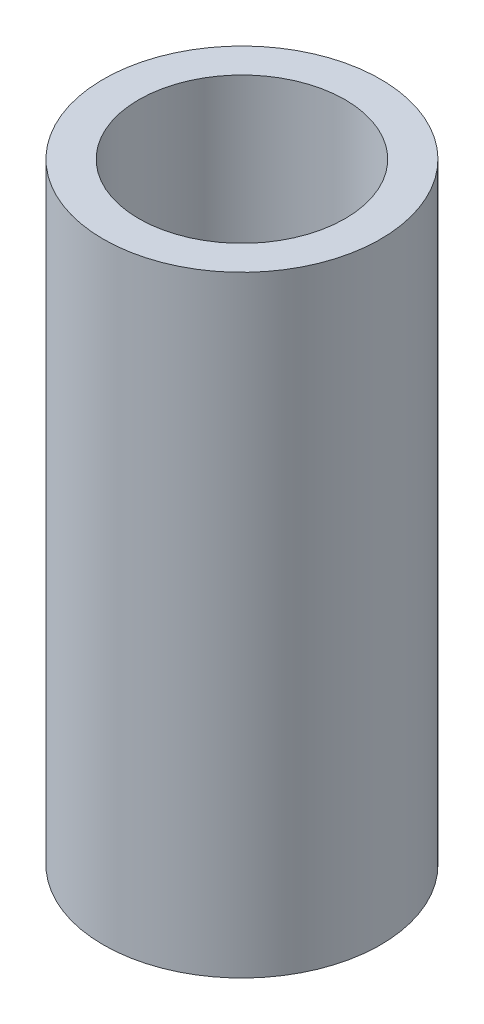
ISO-10303-21;
HEADER;
FILE_DESCRIPTION(('STEP AP214'),'2;1');
FILE_NAME('part.step','',(''),(''),'','','');
FILE_SCHEMA(('AUTOMOTIVE_DESIGN { 1 0 10303 214 1 1 1 1 }'));
ENDSEC;
DATA;
#1=APPLICATION_CONTEXT('core data for automotive mechanical design processes');
#2=APPLICATION_PROTOCOL_DEFINITION('international standard','automotive_design',2000,#1);
#3=PRODUCT_CONTEXT('',#1,'mechanical');
#4=PRODUCT('Part','Part','',(#3));
#5=PRODUCT_RELATED_PRODUCT_CATEGORY('part','',(#4));
#6=PRODUCT_DEFINITION_FORMATION('','',#4);
#7=PRODUCT_DEFINITION_CONTEXT('part definition',#1,'design');
#8=PRODUCT_DEFINITION('design','',#6,#7);
#9=PRODUCT_DEFINITION_SHAPE('','',#8);
#10=(LENGTH_UNIT() NAMED_UNIT(*) SI_UNIT(.MILLI.,.METRE.));
#11=(NAMED_UNIT(*) PLANE_ANGLE_UNIT() SI_UNIT($,.RADIAN.));
#12=(NAMED_UNIT(*) SI_UNIT($,.STERADIAN.) SOLID_ANGLE_UNIT());
#13=UNCERTAINTY_MEASURE_WITH_UNIT(LENGTH_MEASURE(1.E-05),#10,'distance_accuracy_value','');
#14=(GEOMETRIC_REPRESENTATION_CONTEXT(3) GLOBAL_UNCERTAINTY_ASSIGNED_CONTEXT((#13)) GLOBAL_UNIT_ASSIGNED_CONTEXT((#10,
#11,#12)) REPRESENTATION_CONTEXT('',''));
#15=CARTESIAN_POINT('',(0.,0.,0.));
#16=DIRECTION('',(0.,0.,1.));
#17=DIRECTION('',(1.,0.,0.));
#18=AXIS2_PLACEMENT_3D('',#15,#16,#17);
#19=CARTESIAN_POINT('',(0.,3.5,0.));
#20=DIRECTION('',(0.,-1.,0.));
#21=DIRECTION('',(0.,0.,-1.));
#22=AXIS2_PLACEMENT_3D('',#19,#20,#21);
#23=CYLINDRICAL_SURFACE('',#22,1.5875);
#24=CARTESIAN_POINT('',(0.,3.5,0.));
#25=DIRECTION('',(0.,1.,0.));
#26=DIRECTION('',(0.,0.,1.));
#27=AXIS2_PLACEMENT_3D('',#24,#25,#26);
#28=CIRCLE('',#27,1.5875);
#29=CARTESIAN_POINT('',(0.,3.5,1.5875));
#30=VERTEX_POINT('',#29);
#31=EDGE_CURVE('E10',#30,#30,#28,.T.);
#32=ORIENTED_EDGE('',*,*,#31,.F.);
#33=EDGE_LOOP('',(#32));
#34=FACE_BOUND('',#33,.T.);
#35=CARTESIAN_POINT('',(0.,-3.5,0.));
#36=DIRECTION('',(0.,1.,0.));
#37=DIRECTION('',(0.,0.,1.));
#38=AXIS2_PLACEMENT_3D('',#35,#36,#37);
#39=CIRCLE('',#38,1.5875);
#40=CARTESIAN_POINT('',(0.,-3.5,1.5875));
#41=VERTEX_POINT('',#40);
#42=EDGE_CURVE('E34',#41,#41,#39,.T.);
#43=ORIENTED_EDGE('',*,*,#42,.T.);
#44=EDGE_LOOP('',(#43));
#45=FACE_BOUND('',#44,.T.);
#46=ADVANCED_FACE('F31',(#34,#45),#23,.T.);
#47=CARTESIAN_POINT('',(0.,3.5,0.));
#48=DIRECTION('',(0.,1.,0.));
#49=DIRECTION('',(0.,0.,1.));
#50=AXIS2_PLACEMENT_3D('',#47,#48,#49);
#51=PLANE('',#50);
#52=CARTESIAN_POINT('',(0.,3.5,0.));
#53=DIRECTION('',(0.,1.,0.));
#54=DIRECTION('',(0.,0.,1.));
#55=AXIS2_PLACEMENT_3D('',#52,#53,#54);
#56=CIRCLE('',#55,1.1811);
#57=CARTESIAN_POINT('',(0.,3.5,1.1811));
#58=VERTEX_POINT('',#57);
#59=EDGE_CURVE('E43',#58,#58,#56,.T.);
#60=ORIENTED_EDGE('',*,*,#59,.F.);
#61=EDGE_LOOP('',(#60));
#62=FACE_BOUND('',#61,.T.);
#63=ORIENTED_EDGE('',*,*,#31,.T.);
#64=EDGE_LOOP('',(#63));
#65=FACE_BOUND('',#64,.T.);
#66=ADVANCED_FACE('F58',(#62,#65),#51,.T.);
#67=CARTESIAN_POINT('',(0.,-3.5,0.));
#68=DIRECTION('',(0.,1.,0.));
#69=DIRECTION('',(0.,0.,1.));
#70=AXIS2_PLACEMENT_3D('',#67,#68,#69);
#71=PLANE('',#70);
#72=CARTESIAN_POINT('',(0.,-3.5,0.));
#73=DIRECTION('',(0.,1.,0.));
#74=DIRECTION('',(0.,0.,1.));
#75=AXIS2_PLACEMENT_3D('',#72,#73,#74);
#76=CIRCLE('',#75,1.1811);
#77=CARTESIAN_POINT('',(0.,-3.5,1.1811));
#78=VERTEX_POINT('',#77);
#79=EDGE_CURVE('E41',#78,#78,#76,.T.);
#80=ORIENTED_EDGE('',*,*,#79,.T.);
#81=EDGE_LOOP('',(#80));
#82=FACE_BOUND('',#81,.T.);
#83=ORIENTED_EDGE('',*,*,#42,.F.);
#84=EDGE_LOOP('',(#83));
#85=FACE_BOUND('',#84,.T.);
#86=ADVANCED_FACE('F49',(#82,#85),#71,.F.);
#87=CARTESIAN_POINT('',(0.,-3.5,0.));
#88=DIRECTION('',(0.,1.,0.));
#89=DIRECTION('',(0.,0.,1.));
#90=AXIS2_PLACEMENT_3D('',#87,#88,#89);
#91=CYLINDRICAL_SURFACE('',#90,1.1811);
#92=ORIENTED_EDGE('',*,*,#79,.F.);
#93=EDGE_LOOP('',(#92));
#94=FACE_BOUND('',#93,.T.);
#95=ORIENTED_EDGE('',*,*,#59,.T.);
#96=EDGE_LOOP('',(#95));
#97=FACE_BOUND('',#96,.T.);
#98=ADVANCED_FACE('F52',(#94,#97),#91,.F.);
#99=CLOSED_SHELL('',(#46,#66,#86,#98));
#100=MANIFOLD_SOLID_BREP('B2',#99);
#101=ADVANCED_BREP_SHAPE_REPRESENTATION('',(#18,#100),#14);
#102=SHAPE_DEFINITION_REPRESENTATION(#9,#101);
ENDSEC;
END-ISO-10303-21;
